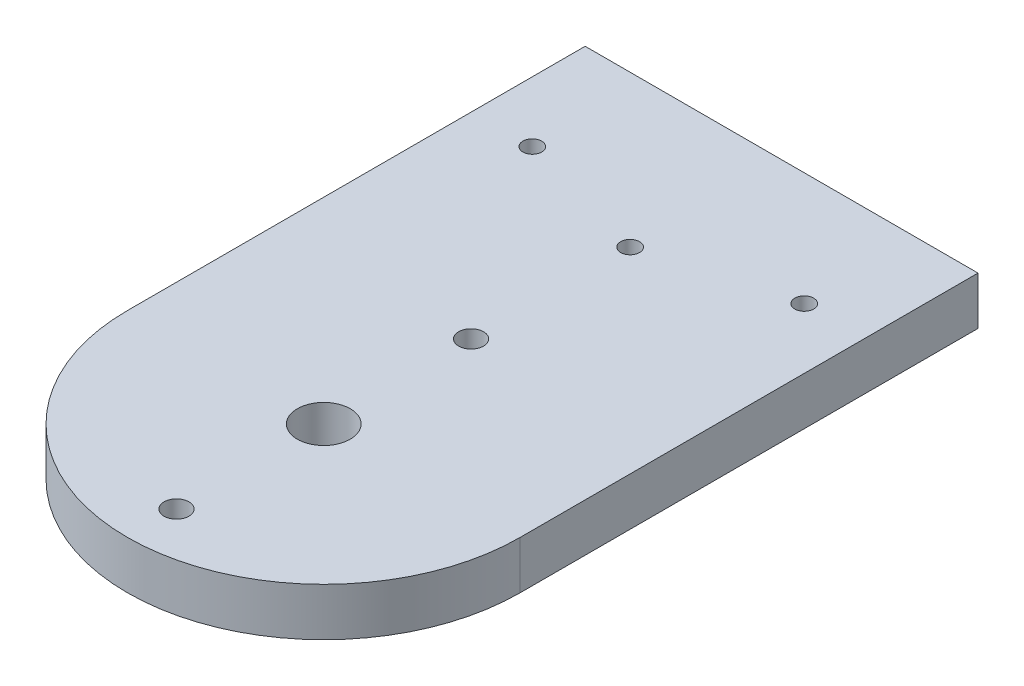
ISO-10303-21;
HEADER;
FILE_DESCRIPTION(('STEP AP214'),'2;1');
FILE_NAME('part.step','',(''),(''),'','','');
FILE_SCHEMA(('AUTOMOTIVE_DESIGN { 1 0 10303 214 1 1 1 1 }'));
ENDSEC;
DATA;
#1=APPLICATION_CONTEXT('core data for automotive mechanical design processes');
#2=APPLICATION_PROTOCOL_DEFINITION('international standard','automotive_design',2000,#1);
#3=PRODUCT_CONTEXT('',#1,'mechanical');
#4=PRODUCT('Part','Part','',(#3));
#5=PRODUCT_RELATED_PRODUCT_CATEGORY('part','',(#4));
#6=PRODUCT_DEFINITION_FORMATION('','',#4);
#7=PRODUCT_DEFINITION_CONTEXT('part definition',#1,'design');
#8=PRODUCT_DEFINITION('design','',#6,#7);
#9=PRODUCT_DEFINITION_SHAPE('','',#8);
#10=(LENGTH_UNIT() NAMED_UNIT(*) SI_UNIT(.MILLI.,.METRE.));
#11=(NAMED_UNIT(*) PLANE_ANGLE_UNIT() SI_UNIT($,.RADIAN.));
#12=(NAMED_UNIT(*) SI_UNIT($,.STERADIAN.) SOLID_ANGLE_UNIT());
#13=UNCERTAINTY_MEASURE_WITH_UNIT(LENGTH_MEASURE(1.E-05),#10,'distance_accuracy_value','');
#14=(GEOMETRIC_REPRESENTATION_CONTEXT(3) GLOBAL_UNCERTAINTY_ASSIGNED_CONTEXT((#13)) GLOBAL_UNIT_ASSIGNED_CONTEXT((#10,
#11,#12)) REPRESENTATION_CONTEXT('',''));
#15=CARTESIAN_POINT('',(0.,0.,0.));
#16=DIRECTION('',(0.,0.,1.));
#17=DIRECTION('',(1.,0.,0.));
#18=AXIS2_PLACEMENT_3D('',#15,#16,#17);
#19=CARTESIAN_POINT('',(126.4,-4.175,275.95));
#20=DIRECTION('',(1.,0.,0.));
#21=DIRECTION('',(0.,0.,-1.));
#22=AXIS2_PLACEMENT_3D('',#19,#20,#21);
#23=PLANE('',#22);
#24=DIRECTION('',(0.,0.,1.));
#25=VECTOR('',#24,1.);
#26=CARTESIAN_POINT('',(126.4,-10.525,275.95));
#27=LINE('',#26,#25);
#28=CARTESIAN_POINT('',(126.4,-10.525,275.95));
#29=VERTEX_POINT('',#28);
#30=CARTESIAN_POINT('',(126.4,-10.525,336.55));
#31=VERTEX_POINT('',#30);
#32=EDGE_CURVE('E92',#29,#31,#27,.T.);
#33=ORIENTED_EDGE('',*,*,#32,.T.);
#34=DIRECTION('',(0.,-1.,0.));
#35=VECTOR('',#34,1.);
#36=CARTESIAN_POINT('',(126.4,-4.175,336.55));
#37=LINE('',#36,#35);
#38=CARTESIAN_POINT('',(126.4,-4.175,336.55));
#39=VERTEX_POINT('',#38);
#40=EDGE_CURVE('E11',#39,#31,#37,.T.);
#41=ORIENTED_EDGE('',*,*,#40,.F.);
#42=DIRECTION('',(0.,0.,1.));
#43=VECTOR('',#42,1.);
#44=CARTESIAN_POINT('',(126.4,-4.175,275.95));
#45=LINE('',#44,#43);
#46=CARTESIAN_POINT('',(126.4,-4.175,275.95));
#47=VERTEX_POINT('',#46);
#48=EDGE_CURVE('E89',#47,#39,#45,.T.);
#49=ORIENTED_EDGE('',*,*,#48,.F.);
#50=DIRECTION('',(0.,-1.,0.));
#51=VECTOR('',#50,1.);
#52=CARTESIAN_POINT('',(126.4,-4.175,275.95));
#53=LINE('',#52,#51);
#54=EDGE_CURVE('E83',#47,#29,#53,.T.);
#55=ORIENTED_EDGE('',*,*,#54,.T.);
#56=EDGE_LOOP('',(#33,#41,#49,#55));
#57=FACE_BOUND('',#56,.T.);
#58=ADVANCED_FACE('F44',(#57),#23,.F.);
#59=CARTESIAN_POINT('',(178.4,-4.175,275.95));
#60=DIRECTION('',(-1.,0.,0.));
#61=DIRECTION('',(0.,0.,1.));
#62=AXIS2_PLACEMENT_3D('',#59,#60,#61);
#63=PLANE('',#62);
#64=DIRECTION('',(0.,0.,-1.));
#65=VECTOR('',#64,1.);
#66=CARTESIAN_POINT('',(178.4,-10.525,275.95));
#67=LINE('',#66,#65);
#68=CARTESIAN_POINT('',(178.4,-10.525,336.55));
#69=VERTEX_POINT('',#68);
#70=CARTESIAN_POINT('',(178.4,-10.525,275.95));
#71=VERTEX_POINT('',#70);
#72=EDGE_CURVE('E77',#69,#71,#67,.T.);
#73=ORIENTED_EDGE('',*,*,#72,.T.);
#74=DIRECTION('',(0.,-1.,0.));
#75=VECTOR('',#74,1.);
#76=CARTESIAN_POINT('',(178.4,-4.175,275.95));
#77=LINE('',#76,#75);
#78=CARTESIAN_POINT('',(178.4,-4.175,275.95));
#79=VERTEX_POINT('',#78);
#80=EDGE_CURVE('E86',#79,#71,#77,.T.);
#81=ORIENTED_EDGE('',*,*,#80,.F.);
#82=DIRECTION('',(0.,0.,-1.));
#83=VECTOR('',#82,1.);
#84=CARTESIAN_POINT('',(178.4,-4.175,275.95));
#85=LINE('',#84,#83);
#86=CARTESIAN_POINT('',(178.4,-4.175,336.55));
#87=VERTEX_POINT('',#86);
#88=EDGE_CURVE('E117',#87,#79,#85,.T.);
#89=ORIENTED_EDGE('',*,*,#88,.F.);
#90=DIRECTION('',(0.,-1.,0.));
#91=VECTOR('',#90,1.);
#92=CARTESIAN_POINT('',(178.4,-4.175,336.55));
#93=LINE('',#92,#91);
#94=EDGE_CURVE('E53',#87,#69,#93,.T.);
#95=ORIENTED_EDGE('',*,*,#94,.T.);
#96=EDGE_LOOP('',(#73,#81,#89,#95));
#97=FACE_BOUND('',#96,.T.);
#98=ADVANCED_FACE('F116',(#97),#63,.F.);
#99=CARTESIAN_POINT('',(126.4,-4.175,275.95));
#100=DIRECTION('',(0.,0.,1.));
#101=DIRECTION('',(1.,0.,0.));
#102=AXIS2_PLACEMENT_3D('',#99,#100,#101);
#103=PLANE('',#102);
#104=CARTESIAN_POINT('',(130.4,-7.35,275.95));
#105=DIRECTION('',(0.,0.,1.));
#106=DIRECTION('',(1.,0.,0.));
#107=AXIS2_PLACEMENT_3D('',#104,#105,#106);
#108=CIRCLE('',#107,2.);
#109=CARTESIAN_POINT('',(132.4,-7.35,275.95));
#110=VERTEX_POINT('',#109);
#111=EDGE_CURVE('E185',#110,#110,#108,.T.);
#112=ORIENTED_EDGE('',*,*,#111,.T.);
#113=EDGE_LOOP('',(#112));
#114=FACE_BOUND('',#113,.T.);
#115=CARTESIAN_POINT('',(174.4,-7.35,275.95));
#116=DIRECTION('',(0.,0.,1.));
#117=DIRECTION('',(1.,0.,0.));
#118=AXIS2_PLACEMENT_3D('',#115,#116,#117);
#119=CIRCLE('',#118,2.);
#120=CARTESIAN_POINT('',(176.4,-7.35,275.95));
#121=VERTEX_POINT('',#120);
#122=EDGE_CURVE('E180',#121,#121,#119,.T.);
#123=ORIENTED_EDGE('',*,*,#122,.T.);
#124=EDGE_LOOP('',(#123));
#125=FACE_BOUND('',#124,.T.);
#126=DIRECTION('',(-1.,0.,0.));
#127=VECTOR('',#126,1.);
#128=CARTESIAN_POINT('',(126.4,-10.525,275.95));
#129=LINE('',#128,#127);
#130=EDGE_CURVE('E84',#71,#29,#129,.T.);
#131=ORIENTED_EDGE('',*,*,#130,.T.);
#132=ORIENTED_EDGE('',*,*,#54,.F.);
#133=DIRECTION('',(-1.,0.,0.));
#134=VECTOR('',#133,1.);
#135=CARTESIAN_POINT('',(126.4,-4.175,275.95));
#136=LINE('',#135,#134);
#137=EDGE_CURVE('E61',#79,#47,#136,.T.);
#138=ORIENTED_EDGE('',*,*,#137,.F.);
#139=ORIENTED_EDGE('',*,*,#80,.T.);
#140=EDGE_LOOP('',(#131,#132,#138,#139));
#141=FACE_BOUND('',#140,.T.);
#142=ADVANCED_FACE('F85',(#114,#125,#141),#103,.F.);
#143=CARTESIAN_POINT('',(0.,-4.175,0.));
#144=DIRECTION('',(0.,1.,0.));
#145=DIRECTION('',(0.,0.,1.));
#146=AXIS2_PLACEMENT_3D('',#143,#144,#145);
#147=PLANE('',#146);
#148=CARTESIAN_POINT('',(152.4,-4.175,296.));
#149=DIRECTION('',(0.,1.,0.));
#150=DIRECTION('',(0.,0.,1.));
#151=AXIS2_PLACEMENT_3D('',#148,#149,#150);
#152=CIRCLE('',#151,1.25);
#153=CARTESIAN_POINT('',(152.4,-4.175,294.75));
#154=VERTEX_POINT('',#153);
#155=EDGE_CURVE('E178',#154,#154,#152,.T.);
#156=ORIENTED_EDGE('',*,*,#155,.F.);
#157=EDGE_LOOP('',(#156));
#158=FACE_BOUND('',#157,.T.);
#159=CARTESIAN_POINT('',(134.4,-4.175,290.95));
#160=DIRECTION('',(0.,1.,0.));
#161=DIRECTION('',(0.,0.,1.));
#162=AXIS2_PLACEMENT_3D('',#159,#160,#161);
#163=CIRCLE('',#162,1.25);
#164=CARTESIAN_POINT('',(134.4,-4.175,289.7));
#165=VERTEX_POINT('',#164);
#166=EDGE_CURVE('E149',#165,#165,#163,.T.);
#167=ORIENTED_EDGE('',*,*,#166,.F.);
#168=EDGE_LOOP('',(#167));
#169=FACE_BOUND('',#168,.T.);
#170=CARTESIAN_POINT('',(170.4,-4.175,290.95));
#171=DIRECTION('',(0.,1.,0.));
#172=DIRECTION('',(0.,0.,1.));
#173=AXIS2_PLACEMENT_3D('',#170,#171,#172);
#174=CIRCLE('',#173,1.25);
#175=CARTESIAN_POINT('',(170.4,-4.175,289.7));
#176=VERTEX_POINT('',#175);
#177=EDGE_CURVE('E156',#176,#176,#174,.T.);
#178=ORIENTED_EDGE('',*,*,#177,.F.);
#179=EDGE_LOOP('',(#178));
#180=FACE_BOUND('',#179,.T.);
#181=CARTESIAN_POINT('',(152.4,-4.175,317.05));
#182=DIRECTION('',(0.,1.,0.));
#183=DIRECTION('',(0.,0.,1.));
#184=AXIS2_PLACEMENT_3D('',#181,#182,#183);
#185=CIRCLE('',#184,1.65000000000002);
#186=CARTESIAN_POINT('',(152.4,-4.175,315.4));
#187=VERTEX_POINT('',#186);
#188=EDGE_CURVE('E142',#187,#187,#185,.T.);
#189=ORIENTED_EDGE('',*,*,#188,.F.);
#190=EDGE_LOOP('',(#189));
#191=FACE_BOUND('',#190,.T.);
#192=CARTESIAN_POINT('',(152.4,-4.175,356.05));
#193=DIRECTION('',(0.,1.,0.));
#194=DIRECTION('',(0.,0.,1.));
#195=AXIS2_PLACEMENT_3D('',#192,#193,#194);
#196=CIRCLE('',#195,1.65000000000002);
#197=CARTESIAN_POINT('',(152.4,-4.175,354.4));
#198=VERTEX_POINT('',#197);
#199=EDGE_CURVE('E147',#198,#198,#196,.T.);
#200=ORIENTED_EDGE('',*,*,#199,.F.);
#201=EDGE_LOOP('',(#200));
#202=FACE_BOUND('',#201,.T.);
#203=CARTESIAN_POINT('',(152.4,-4.175,336.55));
#204=DIRECTION('',(0.,1.,0.));
#205=DIRECTION('',(0.,0.,1.));
#206=AXIS2_PLACEMENT_3D('',#203,#204,#205);
#207=CIRCLE('',#206,3.49999999999999);
#208=CARTESIAN_POINT('',(152.4,-4.175,333.05));
#209=VERTEX_POINT('',#208);
#210=EDGE_CURVE('E131',#209,#209,#207,.T.);
#211=ORIENTED_EDGE('',*,*,#210,.F.);
#212=EDGE_LOOP('',(#211));
#213=FACE_BOUND('',#212,.T.);
#214=ORIENTED_EDGE('',*,*,#48,.T.);
#215=CARTESIAN_POINT('',(152.4,-4.175,336.55));
#216=DIRECTION('',(0.,1.,0.));
#217=DIRECTION('',(0.,0.,1.));
#218=AXIS2_PLACEMENT_3D('',#215,#216,#217);
#219=CIRCLE('',#218,26.);
#220=EDGE_CURVE('E105',#39,#87,#219,.T.);
#221=ORIENTED_EDGE('',*,*,#220,.T.);
#222=ORIENTED_EDGE('',*,*,#88,.T.);
#223=ORIENTED_EDGE('',*,*,#137,.T.);
#224=EDGE_LOOP('',(#214,#221,#222,#223));
#225=FACE_BOUND('',#224,.T.);
#226=ADVANCED_FACE('F121',(#158,#169,#180,#191,#202,#213,#225),#147,.T.);
#227=CARTESIAN_POINT('',(0.,-10.525,0.));
#228=DIRECTION('',(0.,1.,0.));
#229=DIRECTION('',(0.,0.,1.));
#230=AXIS2_PLACEMENT_3D('',#227,#228,#229);
#231=PLANE('',#230);
#232=CARTESIAN_POINT('',(152.4,-10.525,296.));
#233=DIRECTION('',(0.,1.,0.));
#234=DIRECTION('',(0.,0.,1.));
#235=AXIS2_PLACEMENT_3D('',#232,#233,#234);
#236=CIRCLE('',#235,1.25);
#237=CARTESIAN_POINT('',(152.4,-10.525,294.75));
#238=VERTEX_POINT('',#237);
#239=EDGE_CURVE('E186',#238,#238,#236,.T.);
#240=ORIENTED_EDGE('',*,*,#239,.T.);
#241=EDGE_LOOP('',(#240));
#242=FACE_BOUND('',#241,.T.);
#243=CARTESIAN_POINT('',(134.4,-10.525,290.95));
#244=DIRECTION('',(0.,1.,0.));
#245=DIRECTION('',(0.,0.,1.));
#246=AXIS2_PLACEMENT_3D('',#243,#244,#245);
#247=CIRCLE('',#246,1.25);
#248=CARTESIAN_POINT('',(134.4,-10.525,289.7));
#249=VERTEX_POINT('',#248);
#250=EDGE_CURVE('E168',#249,#249,#247,.T.);
#251=ORIENTED_EDGE('',*,*,#250,.T.);
#252=EDGE_LOOP('',(#251));
#253=FACE_BOUND('',#252,.T.);
#254=CARTESIAN_POINT('',(170.4,-10.525,290.95));
#255=DIRECTION('',(0.,1.,0.));
#256=DIRECTION('',(0.,0.,1.));
#257=AXIS2_PLACEMENT_3D('',#254,#255,#256);
#258=CIRCLE('',#257,1.25);
#259=CARTESIAN_POINT('',(170.4,-10.525,289.7));
#260=VERTEX_POINT('',#259);
#261=EDGE_CURVE('E163',#260,#260,#258,.T.);
#262=ORIENTED_EDGE('',*,*,#261,.T.);
#263=EDGE_LOOP('',(#262));
#264=FACE_BOUND('',#263,.T.);
#265=CARTESIAN_POINT('',(152.4,-10.525,317.05));
#266=DIRECTION('',(0.,1.,0.));
#267=DIRECTION('',(0.,0.,1.));
#268=AXIS2_PLACEMENT_3D('',#265,#266,#267);
#269=CIRCLE('',#268,1.65000000000002);
#270=CARTESIAN_POINT('',(152.4,-10.525,315.4));
#271=VERTEX_POINT('',#270);
#272=EDGE_CURVE('E143',#271,#271,#269,.T.);
#273=ORIENTED_EDGE('',*,*,#272,.T.);
#274=EDGE_LOOP('',(#273));
#275=FACE_BOUND('',#274,.T.);
#276=CARTESIAN_POINT('',(152.4,-10.525,356.05));
#277=DIRECTION('',(0.,1.,0.));
#278=DIRECTION('',(0.,0.,1.));
#279=AXIS2_PLACEMENT_3D('',#276,#277,#278);
#280=CIRCLE('',#279,1.65000000000002);
#281=CARTESIAN_POINT('',(152.4,-10.525,354.4));
#282=VERTEX_POINT('',#281);
#283=EDGE_CURVE('E136',#282,#282,#280,.T.);
#284=ORIENTED_EDGE('',*,*,#283,.T.);
#285=EDGE_LOOP('',(#284));
#286=FACE_BOUND('',#285,.T.);
#287=CARTESIAN_POINT('',(152.4,-10.525,336.55));
#288=DIRECTION('',(0.,1.,0.));
#289=DIRECTION('',(0.,0.,1.));
#290=AXIS2_PLACEMENT_3D('',#287,#288,#289);
#291=CIRCLE('',#290,3.49999999999999);
#292=CARTESIAN_POINT('',(152.4,-10.525,333.05));
#293=VERTEX_POINT('',#292);
#294=EDGE_CURVE('E133',#293,#293,#291,.T.);
#295=ORIENTED_EDGE('',*,*,#294,.T.);
#296=EDGE_LOOP('',(#295));
#297=FACE_BOUND('',#296,.T.);
#298=ORIENTED_EDGE('',*,*,#72,.F.);
#299=CARTESIAN_POINT('',(152.4,-10.525,336.55));
#300=DIRECTION('',(0.,1.,0.));
#301=DIRECTION('',(0.,0.,1.));
#302=AXIS2_PLACEMENT_3D('',#299,#300,#301);
#303=CIRCLE('',#302,26.);
#304=EDGE_CURVE('E99',#31,#69,#303,.T.);
#305=ORIENTED_EDGE('',*,*,#304,.F.);
#306=ORIENTED_EDGE('',*,*,#32,.F.);
#307=ORIENTED_EDGE('',*,*,#130,.F.);
#308=EDGE_LOOP('',(#298,#305,#306,#307));
#309=FACE_BOUND('',#308,.T.);
#310=ADVANCED_FACE('F100',(#242,#253,#264,#275,#286,#297,#309),#231,.F.);
#311=CARTESIAN_POINT('',(152.4,-4.175,336.55));
#312=DIRECTION('',(0.,-1.,0.));
#313=DIRECTION('',(0.,0.,-1.));
#314=AXIS2_PLACEMENT_3D('',#311,#312,#313);
#315=CYLINDRICAL_SURFACE('',#314,26.);
#316=ORIENTED_EDGE('',*,*,#220,.F.);
#317=ORIENTED_EDGE('',*,*,#40,.T.);
#318=ORIENTED_EDGE('',*,*,#304,.T.);
#319=ORIENTED_EDGE('',*,*,#94,.F.);
#320=EDGE_LOOP('',(#316,#317,#318,#319));
#321=FACE_BOUND('',#320,.T.);
#322=ADVANCED_FACE('F122',(#321),#315,.T.);
#323=CARTESIAN_POINT('',(152.4,-4.175,336.55));
#324=DIRECTION('',(0.,-1.,0.));
#325=DIRECTION('',(0.,0.,-1.));
#326=AXIS2_PLACEMENT_3D('',#323,#324,#325);
#327=CYLINDRICAL_SURFACE('',#326,3.49999999999999);
#328=CARTESIAN_POINT('',(152.4,-4.175,333.05));
#329=CARTESIAN_POINT('',(152.4,-4.24114583333333,333.05));
#330=CARTESIAN_POINT('',(152.4,-4.30729166666667,333.05));
#331=CARTESIAN_POINT('',(152.4,-4.43958333333333,333.05));
#332=CARTESIAN_POINT('',(152.4,-4.50572916666667,333.05));
#333=CARTESIAN_POINT('',(152.4,-4.63802083333333,333.05));
#334=CARTESIAN_POINT('',(152.4,-4.70416666666667,333.05));
#335=CARTESIAN_POINT('',(152.4,-4.83645833333333,333.05));
#336=CARTESIAN_POINT('',(152.4,-4.90260416666667,333.05));
#337=CARTESIAN_POINT('',(152.4,-5.03489583333333,333.05));
#338=CARTESIAN_POINT('',(152.4,-5.10104166666667,333.05));
#339=CARTESIAN_POINT('',(152.4,-5.23333333333333,333.05));
#340=CARTESIAN_POINT('',(152.4,-5.29947916666667,333.05));
#341=CARTESIAN_POINT('',(152.4,-5.43177083333333,333.05));
#342=CARTESIAN_POINT('',(152.4,-5.49791666666667,333.05));
#343=CARTESIAN_POINT('',(152.4,-5.63020833333333,333.05));
#344=CARTESIAN_POINT('',(152.4,-5.69635416666667,333.05));
#345=CARTESIAN_POINT('',(152.4,-5.82864583333333,333.05));
#346=CARTESIAN_POINT('',(152.4,-5.89479166666667,333.05));
#347=CARTESIAN_POINT('',(152.4,-6.02708333333333,333.05));
#348=CARTESIAN_POINT('',(152.4,-6.09322916666667,333.05));
#349=CARTESIAN_POINT('',(152.4,-6.22552083333333,333.05));
#350=CARTESIAN_POINT('',(152.4,-6.29166666666667,333.05));
#351=CARTESIAN_POINT('',(152.4,-6.42395833333333,333.05));
#352=CARTESIAN_POINT('',(152.4,-6.49010416666667,333.05));
#353=CARTESIAN_POINT('',(152.4,-6.62239583333333,333.05));
#354=CARTESIAN_POINT('',(152.4,-6.68854166666667,333.05));
#355=CARTESIAN_POINT('',(152.4,-6.82083333333333,333.05));
#356=CARTESIAN_POINT('',(152.4,-6.88697916666667,333.05));
#357=CARTESIAN_POINT('',(152.4,-7.01927083333333,333.05));
#358=CARTESIAN_POINT('',(152.4,-7.08541666666667,333.05));
#359=CARTESIAN_POINT('',(152.4,-7.21770833333333,333.05));
#360=CARTESIAN_POINT('',(152.4,-7.28385416666667,333.05));
#361=CARTESIAN_POINT('',(152.4,-7.41614583333333,333.05));
#362=CARTESIAN_POINT('',(152.4,-7.48229166666667,333.05));
#363=CARTESIAN_POINT('',(152.4,-7.61458333333333,333.05));
#364=CARTESIAN_POINT('',(152.4,-7.68072916666667,333.05));
#365=CARTESIAN_POINT('',(152.4,-7.81302083333333,333.05));
#366=CARTESIAN_POINT('',(152.4,-7.87916666666667,333.05));
#367=CARTESIAN_POINT('',(152.4,-8.01145833333334,333.05));
#368=CARTESIAN_POINT('',(152.4,-8.07760416666667,333.05));
#369=CARTESIAN_POINT('',(152.4,-8.20989583333333,333.05));
#370=CARTESIAN_POINT('',(152.4,-8.27604166666667,333.05));
#371=CARTESIAN_POINT('',(152.4,-8.40833333333333,333.05));
#372=CARTESIAN_POINT('',(152.4,-8.47447916666667,333.05));
#373=CARTESIAN_POINT('',(152.4,-8.60677083333333,333.05));
#374=CARTESIAN_POINT('',(152.4,-8.67291666666667,333.05));
#375=CARTESIAN_POINT('',(152.4,-8.80520833333333,333.05));
#376=CARTESIAN_POINT('',(152.4,-8.87135416666667,333.05));
#377=CARTESIAN_POINT('',(152.4,-9.00364583333333,333.05));
#378=CARTESIAN_POINT('',(152.4,-9.06979166666667,333.05));
#379=CARTESIAN_POINT('',(152.4,-9.20208333333333,333.05));
#380=CARTESIAN_POINT('',(152.4,-9.26822916666667,333.05));
#381=CARTESIAN_POINT('',(152.4,-9.40052083333333,333.05));
#382=CARTESIAN_POINT('',(152.4,-9.46666666666667,333.05));
#383=CARTESIAN_POINT('',(152.4,-9.59895833333333,333.05));
#384=CARTESIAN_POINT('',(152.4,-9.66510416666667,333.05));
#385=CARTESIAN_POINT('',(152.4,-9.79739583333333,333.05));
#386=CARTESIAN_POINT('',(152.4,-9.86354166666667,333.05));
#387=CARTESIAN_POINT('',(152.4,-9.99583333333333,333.05));
#388=CARTESIAN_POINT('',(152.4,-10.0619791666667,333.05));
#389=CARTESIAN_POINT('',(152.4,-10.1942708333333,333.05));
#390=CARTESIAN_POINT('',(152.4,-10.2604166666667,333.05));
#391=CARTESIAN_POINT('',(152.4,-10.3927083333333,333.05));
#392=CARTESIAN_POINT('',(152.4,-10.4588541666667,333.05));
#393=CARTESIAN_POINT('',(152.4,-10.525,333.05));
#394=B_SPLINE_CURVE_WITH_KNOTS('',3,(#328,#329,#330,#331,#332,#333,#334,#335,#336,#337,#338,
#339,#340,#341,#342,#343,#344,#345,#346,#347,#348,#349,#350,#351,#352,#353,#354,#355,#356,#357,
#358,#359,#360,#361,#362,#363,#364,#365,#366,#367,#368,#369,#370,#371,#372,#373,#374,#375,#376,
#377,#378,#379,#380,#381,#382,#383,#384,#385,#386,#387,#388,#389,#390,#391,#392,#393),
.UNSPECIFIED.,.F.,.F.,(4,2,2,2,2,2,2,2,2,2,2,2,2,2,2,2,2,2,2,2,2,2,2,2,2,2,2,2,2,2,2,2,4),(0.,
0.198437500000001,0.396875000000001,0.5953125,0.79375,0.992187500000001,1.190625,1.3890625,
1.5875,1.7859375,1.984375,2.1828125,2.38125,2.5796875,2.778125,2.9765625,3.175,3.3734375,
3.571875,3.7703125,3.96875,4.1671875,4.365625,4.5640625,4.7625,4.9609375,5.159375,5.3578125,
5.55625,5.7546875,5.953125,6.1515625,6.35),.UNSPECIFIED.);
#395=EDGE_CURVE('BSEAM215',#209,#293,#394,.T.);
#396=ORIENTED_EDGE('',*,*,#210,.T.);
#397=ORIENTED_EDGE('',*,*,#294,.F.);
#398=ORIENTED_EDGE('',*,*,#395,.T.);
#399=ORIENTED_EDGE('',*,*,#395,.F.);
#400=EDGE_LOOP('',(#396,#398,#397,#399));
#401=FACE_BOUND('',#400,.T.);
#402=ADVANCED_FACE('F215',(#401),#327,.F.);
#403=CARTESIAN_POINT('',(152.4,-4.175,356.05));
#404=DIRECTION('',(0.,-1.,0.));
#405=DIRECTION('',(0.,0.,-1.));
#406=AXIS2_PLACEMENT_3D('',#403,#404,#405);
#407=CYLINDRICAL_SURFACE('',#406,1.65000000000002);
#408=CARTESIAN_POINT('',(152.4,-4.175,354.4));
#409=CARTESIAN_POINT('',(152.4,-4.24114583333333,354.4));
#410=CARTESIAN_POINT('',(152.4,-4.30729166666667,354.4));
#411=CARTESIAN_POINT('',(152.4,-4.43958333333333,354.4));
#412=CARTESIAN_POINT('',(152.4,-4.50572916666667,354.4));
#413=CARTESIAN_POINT('',(152.4,-4.63802083333333,354.4));
#414=CARTESIAN_POINT('',(152.4,-4.70416666666667,354.4));
#415=CARTESIAN_POINT('',(152.4,-4.83645833333333,354.4));
#416=CARTESIAN_POINT('',(152.4,-4.90260416666667,354.4));
#417=CARTESIAN_POINT('',(152.4,-5.03489583333333,354.4));
#418=CARTESIAN_POINT('',(152.4,-5.10104166666667,354.4));
#419=CARTESIAN_POINT('',(152.4,-5.23333333333333,354.4));
#420=CARTESIAN_POINT('',(152.4,-5.29947916666667,354.4));
#421=CARTESIAN_POINT('',(152.4,-5.43177083333333,354.4));
#422=CARTESIAN_POINT('',(152.4,-5.49791666666667,354.4));
#423=CARTESIAN_POINT('',(152.4,-5.63020833333333,354.4));
#424=CARTESIAN_POINT('',(152.4,-5.69635416666667,354.4));
#425=CARTESIAN_POINT('',(152.4,-5.82864583333333,354.4));
#426=CARTESIAN_POINT('',(152.4,-5.89479166666667,354.4));
#427=CARTESIAN_POINT('',(152.4,-6.02708333333333,354.4));
#428=CARTESIAN_POINT('',(152.4,-6.09322916666667,354.4));
#429=CARTESIAN_POINT('',(152.4,-6.22552083333333,354.4));
#430=CARTESIAN_POINT('',(152.4,-6.29166666666667,354.4));
#431=CARTESIAN_POINT('',(152.4,-6.42395833333333,354.4));
#432=CARTESIAN_POINT('',(152.4,-6.49010416666667,354.4));
#433=CARTESIAN_POINT('',(152.4,-6.62239583333333,354.4));
#434=CARTESIAN_POINT('',(152.4,-6.68854166666667,354.4));
#435=CARTESIAN_POINT('',(152.4,-6.82083333333333,354.4));
#436=CARTESIAN_POINT('',(152.4,-6.88697916666667,354.4));
#437=CARTESIAN_POINT('',(152.4,-7.01927083333333,354.4));
#438=CARTESIAN_POINT('',(152.4,-7.08541666666667,354.4));
#439=CARTESIAN_POINT('',(152.4,-7.21770833333333,354.4));
#440=CARTESIAN_POINT('',(152.4,-7.28385416666667,354.4));
#441=CARTESIAN_POINT('',(152.4,-7.41614583333333,354.4));
#442=CARTESIAN_POINT('',(152.4,-7.48229166666667,354.4));
#443=CARTESIAN_POINT('',(152.4,-7.61458333333333,354.4));
#444=CARTESIAN_POINT('',(152.4,-7.68072916666667,354.4));
#445=CARTESIAN_POINT('',(152.4,-7.81302083333333,354.4));
#446=CARTESIAN_POINT('',(152.4,-7.87916666666667,354.4));
#447=CARTESIAN_POINT('',(152.4,-8.01145833333333,354.4));
#448=CARTESIAN_POINT('',(152.4,-8.07760416666667,354.4));
#449=CARTESIAN_POINT('',(152.4,-8.20989583333333,354.4));
#450=CARTESIAN_POINT('',(152.4,-8.27604166666667,354.4));
#451=CARTESIAN_POINT('',(152.4,-8.40833333333333,354.4));
#452=CARTESIAN_POINT('',(152.4,-8.47447916666667,354.4));
#453=CARTESIAN_POINT('',(152.4,-8.60677083333333,354.4));
#454=CARTESIAN_POINT('',(152.4,-8.67291666666667,354.4));
#455=CARTESIAN_POINT('',(152.4,-8.80520833333333,354.4));
#456=CARTESIAN_POINT('',(152.4,-8.87135416666667,354.4));
#457=CARTESIAN_POINT('',(152.4,-9.00364583333333,354.4));
#458=CARTESIAN_POINT('',(152.4,-9.06979166666667,354.4));
#459=CARTESIAN_POINT('',(152.4,-9.20208333333333,354.4));
#460=CARTESIAN_POINT('',(152.4,-9.26822916666667,354.4));
#461=CARTESIAN_POINT('',(152.4,-9.40052083333333,354.4));
#462=CARTESIAN_POINT('',(152.4,-9.46666666666667,354.4));
#463=CARTESIAN_POINT('',(152.4,-9.59895833333333,354.4));
#464=CARTESIAN_POINT('',(152.4,-9.66510416666667,354.4));
#465=CARTESIAN_POINT('',(152.4,-9.79739583333333,354.4));
#466=CARTESIAN_POINT('',(152.4,-9.86354166666667,354.4));
#467=CARTESIAN_POINT('',(152.4,-9.99583333333333,354.4));
#468=CARTESIAN_POINT('',(152.4,-10.0619791666667,354.4));
#469=CARTESIAN_POINT('',(152.4,-10.1942708333333,354.4));
#470=CARTESIAN_POINT('',(152.4,-10.2604166666667,354.4));
#471=CARTESIAN_POINT('',(152.4,-10.3927083333333,354.4));
#472=CARTESIAN_POINT('',(152.4,-10.4588541666667,354.4));
#473=CARTESIAN_POINT('',(152.4,-10.525,354.4));
#474=B_SPLINE_CURVE_WITH_KNOTS('',3,(#408,#409,#410,#411,#412,#413,#414,#415,#416,#417,#418,
#419,#420,#421,#422,#423,#424,#425,#426,#427,#428,#429,#430,#431,#432,#433,#434,#435,#436,#437,
#438,#439,#440,#441,#442,#443,#444,#445,#446,#447,#448,#449,#450,#451,#452,#453,#454,#455,#456,
#457,#458,#459,#460,#461,#462,#463,#464,#465,#466,#467,#468,#469,#470,#471,#472,#473),
.UNSPECIFIED.,.F.,.F.,(4,2,2,2,2,2,2,2,2,2,2,2,2,2,2,2,2,2,2,2,2,2,2,2,2,2,2,2,2,2,2,2,4),(0.,
0.1984375,0.396875,0.595312499999999,0.793749999999999,0.992187499999999,1.190625,1.3890625,
1.5875,1.7859375,1.984375,2.1828125,2.38125,2.5796875,2.778125,2.9765625,3.175,3.3734375,
3.571875,3.7703125,3.96875,4.1671875,4.365625,4.5640625,4.7625,4.9609375,5.159375,5.3578125,
5.55625,5.7546875,5.953125,6.1515625,6.35),.UNSPECIFIED.);
#475=EDGE_CURVE('BSEAM216',#198,#282,#474,.T.);
#476=ORIENTED_EDGE('',*,*,#199,.T.);
#477=ORIENTED_EDGE('',*,*,#283,.F.);
#478=ORIENTED_EDGE('',*,*,#475,.T.);
#479=ORIENTED_EDGE('',*,*,#475,.F.);
#480=EDGE_LOOP('',(#476,#478,#477,#479));
#481=FACE_BOUND('',#480,.T.);
#482=ADVANCED_FACE('F216',(#481),#407,.F.);
#483=CARTESIAN_POINT('',(152.4,-4.175,317.05));
#484=DIRECTION('',(0.,-1.,0.));
#485=DIRECTION('',(0.,0.,-1.));
#486=AXIS2_PLACEMENT_3D('',#483,#484,#485);
#487=CYLINDRICAL_SURFACE('',#486,1.65000000000002);
#488=CARTESIAN_POINT('',(152.4,-4.175,315.4));
#489=CARTESIAN_POINT('',(152.4,-4.24114583333333,315.4));
#490=CARTESIAN_POINT('',(152.4,-4.30729166666667,315.4));
#491=CARTESIAN_POINT('',(152.4,-4.43958333333333,315.4));
#492=CARTESIAN_POINT('',(152.4,-4.50572916666667,315.4));
#493=CARTESIAN_POINT('',(152.4,-4.63802083333333,315.4));
#494=CARTESIAN_POINT('',(152.4,-4.70416666666667,315.4));
#495=CARTESIAN_POINT('',(152.4,-4.83645833333333,315.4));
#496=CARTESIAN_POINT('',(152.4,-4.90260416666667,315.4));
#497=CARTESIAN_POINT('',(152.4,-5.03489583333333,315.4));
#498=CARTESIAN_POINT('',(152.4,-5.10104166666667,315.4));
#499=CARTESIAN_POINT('',(152.4,-5.23333333333333,315.4));
#500=CARTESIAN_POINT('',(152.4,-5.29947916666667,315.4));
#501=CARTESIAN_POINT('',(152.4,-5.43177083333333,315.4));
#502=CARTESIAN_POINT('',(152.4,-5.49791666666667,315.4));
#503=CARTESIAN_POINT('',(152.4,-5.63020833333333,315.4));
#504=CARTESIAN_POINT('',(152.4,-5.69635416666667,315.4));
#505=CARTESIAN_POINT('',(152.4,-5.82864583333333,315.4));
#506=CARTESIAN_POINT('',(152.4,-5.89479166666667,315.4));
#507=CARTESIAN_POINT('',(152.4,-6.02708333333333,315.4));
#508=CARTESIAN_POINT('',(152.4,-6.09322916666667,315.4));
#509=CARTESIAN_POINT('',(152.4,-6.22552083333333,315.4));
#510=CARTESIAN_POINT('',(152.4,-6.29166666666667,315.4));
#511=CARTESIAN_POINT('',(152.4,-6.42395833333333,315.4));
#512=CARTESIAN_POINT('',(152.4,-6.49010416666667,315.4));
#513=CARTESIAN_POINT('',(152.4,-6.62239583333333,315.4));
#514=CARTESIAN_POINT('',(152.4,-6.68854166666667,315.4));
#515=CARTESIAN_POINT('',(152.4,-6.82083333333333,315.4));
#516=CARTESIAN_POINT('',(152.4,-6.88697916666667,315.4));
#517=CARTESIAN_POINT('',(152.4,-7.01927083333333,315.4));
#518=CARTESIAN_POINT('',(152.4,-7.08541666666667,315.4));
#519=CARTESIAN_POINT('',(152.4,-7.21770833333333,315.4));
#520=CARTESIAN_POINT('',(152.4,-7.28385416666667,315.4));
#521=CARTESIAN_POINT('',(152.4,-7.41614583333333,315.4));
#522=CARTESIAN_POINT('',(152.4,-7.48229166666667,315.4));
#523=CARTESIAN_POINT('',(152.4,-7.61458333333333,315.4));
#524=CARTESIAN_POINT('',(152.4,-7.68072916666667,315.4));
#525=CARTESIAN_POINT('',(152.4,-7.81302083333333,315.4));
#526=CARTESIAN_POINT('',(152.4,-7.87916666666667,315.4));
#527=CARTESIAN_POINT('',(152.4,-8.01145833333333,315.4));
#528=CARTESIAN_POINT('',(152.4,-8.07760416666667,315.4));
#529=CARTESIAN_POINT('',(152.4,-8.20989583333333,315.4));
#530=CARTESIAN_POINT('',(152.4,-8.27604166666667,315.4));
#531=CARTESIAN_POINT('',(152.4,-8.40833333333333,315.4));
#532=CARTESIAN_POINT('',(152.4,-8.47447916666667,315.4));
#533=CARTESIAN_POINT('',(152.4,-8.60677083333333,315.4));
#534=CARTESIAN_POINT('',(152.4,-8.67291666666667,315.4));
#535=CARTESIAN_POINT('',(152.4,-8.80520833333333,315.4));
#536=CARTESIAN_POINT('',(152.4,-8.87135416666667,315.4));
#537=CARTESIAN_POINT('',(152.4,-9.00364583333333,315.4));
#538=CARTESIAN_POINT('',(152.4,-9.06979166666667,315.4));
#539=CARTESIAN_POINT('',(152.4,-9.20208333333333,315.4));
#540=CARTESIAN_POINT('',(152.4,-9.26822916666667,315.4));
#541=CARTESIAN_POINT('',(152.4,-9.40052083333333,315.4));
#542=CARTESIAN_POINT('',(152.4,-9.46666666666667,315.4));
#543=CARTESIAN_POINT('',(152.4,-9.59895833333333,315.4));
#544=CARTESIAN_POINT('',(152.4,-9.66510416666667,315.4));
#545=CARTESIAN_POINT('',(152.4,-9.79739583333333,315.4));
#546=CARTESIAN_POINT('',(152.4,-9.86354166666667,315.4));
#547=CARTESIAN_POINT('',(152.4,-9.99583333333333,315.4));
#548=CARTESIAN_POINT('',(152.4,-10.0619791666667,315.4));
#549=CARTESIAN_POINT('',(152.4,-10.1942708333333,315.4));
#550=CARTESIAN_POINT('',(152.4,-10.2604166666667,315.4));
#551=CARTESIAN_POINT('',(152.4,-10.3927083333333,315.4));
#552=CARTESIAN_POINT('',(152.4,-10.4588541666667,315.4));
#553=CARTESIAN_POINT('',(152.4,-10.525,315.4));
#554=B_SPLINE_CURVE_WITH_KNOTS('',3,(#488,#489,#490,#491,#492,#493,#494,#495,#496,#497,#498,
#499,#500,#501,#502,#503,#504,#505,#506,#507,#508,#509,#510,#511,#512,#513,#514,#515,#516,#517,
#518,#519,#520,#521,#522,#523,#524,#525,#526,#527,#528,#529,#530,#531,#532,#533,#534,#535,#536,
#537,#538,#539,#540,#541,#542,#543,#544,#545,#546,#547,#548,#549,#550,#551,#552,#553),
.UNSPECIFIED.,.F.,.F.,(4,2,2,2,2,2,2,2,2,2,2,2,2,2,2,2,2,2,2,2,2,2,2,2,2,2,2,2,2,2,2,2,4),(0.,
0.1984375,0.396875,0.595312499999999,0.793749999999999,0.992187499999999,1.190625,1.3890625,
1.5875,1.7859375,1.984375,2.1828125,2.38125,2.5796875,2.778125,2.9765625,3.175,3.3734375,
3.571875,3.7703125,3.96875,4.1671875,4.365625,4.5640625,4.7625,4.9609375,5.159375,5.3578125,
5.55625,5.7546875,5.953125,6.1515625,6.35),.UNSPECIFIED.);
#555=EDGE_CURVE('BSEAM264',#187,#271,#554,.T.);
#556=ORIENTED_EDGE('',*,*,#188,.T.);
#557=ORIENTED_EDGE('',*,*,#272,.F.);
#558=ORIENTED_EDGE('',*,*,#555,.T.);
#559=ORIENTED_EDGE('',*,*,#555,.F.);
#560=EDGE_LOOP('',(#556,#558,#557,#559));
#561=FACE_BOUND('',#560,.T.);
#562=ADVANCED_FACE('F264',(#561),#487,.F.);
#563=CARTESIAN_POINT('',(170.4,-4.175,290.95));
#564=DIRECTION('',(0.,-1.,0.));
#565=DIRECTION('',(0.,0.,-1.));
#566=AXIS2_PLACEMENT_3D('',#563,#564,#565);
#567=CYLINDRICAL_SURFACE('',#566,1.25);
#568=CARTESIAN_POINT('',(170.4,-4.175,289.7));
#569=CARTESIAN_POINT('',(170.4,-4.24114583333333,289.7));
#570=CARTESIAN_POINT('',(170.4,-4.30729166666667,289.7));
#571=CARTESIAN_POINT('',(170.4,-4.43958333333333,289.7));
#572=CARTESIAN_POINT('',(170.4,-4.50572916666667,289.7));
#573=CARTESIAN_POINT('',(170.4,-4.63802083333333,289.7));
#574=CARTESIAN_POINT('',(170.4,-4.70416666666667,289.7));
#575=CARTESIAN_POINT('',(170.4,-4.83645833333333,289.7));
#576=CARTESIAN_POINT('',(170.4,-4.90260416666667,289.7));
#577=CARTESIAN_POINT('',(170.4,-5.03489583333333,289.7));
#578=CARTESIAN_POINT('',(170.4,-5.10104166666667,289.7));
#579=CARTESIAN_POINT('',(170.4,-5.23333333333333,289.7));
#580=CARTESIAN_POINT('',(170.4,-5.29947916666667,289.7));
#581=CARTESIAN_POINT('',(170.4,-5.43177083333333,289.7));
#582=CARTESIAN_POINT('',(170.4,-5.49791666666667,289.7));
#583=CARTESIAN_POINT('',(170.4,-5.63020833333333,289.7));
#584=CARTESIAN_POINT('',(170.4,-5.69635416666667,289.7));
#585=CARTESIAN_POINT('',(170.4,-5.82864583333333,289.7));
#586=CARTESIAN_POINT('',(170.4,-5.89479166666667,289.7));
#587=CARTESIAN_POINT('',(170.4,-6.02708333333333,289.7));
#588=CARTESIAN_POINT('',(170.4,-6.09322916666667,289.7));
#589=CARTESIAN_POINT('',(170.4,-6.22552083333333,289.7));
#590=CARTESIAN_POINT('',(170.4,-6.29166666666667,289.7));
#591=CARTESIAN_POINT('',(170.4,-6.42395833333333,289.7));
#592=CARTESIAN_POINT('',(170.4,-6.49010416666667,289.7));
#593=CARTESIAN_POINT('',(170.4,-6.62239583333333,289.7));
#594=CARTESIAN_POINT('',(170.4,-6.68854166666667,289.7));
#595=CARTESIAN_POINT('',(170.4,-6.82083333333333,289.7));
#596=CARTESIAN_POINT('',(170.4,-6.88697916666667,289.7));
#597=CARTESIAN_POINT('',(170.4,-7.01927083333333,289.7));
#598=CARTESIAN_POINT('',(170.4,-7.08541666666667,289.7));
#599=CARTESIAN_POINT('',(170.4,-7.21770833333333,289.7));
#600=CARTESIAN_POINT('',(170.4,-7.28385416666667,289.7));
#601=CARTESIAN_POINT('',(170.4,-7.41614583333333,289.7));
#602=CARTESIAN_POINT('',(170.4,-7.48229166666667,289.7));
#603=CARTESIAN_POINT('',(170.4,-7.61458333333333,289.7));
#604=CARTESIAN_POINT('',(170.4,-7.68072916666667,289.7));
#605=CARTESIAN_POINT('',(170.4,-7.81302083333333,289.7));
#606=CARTESIAN_POINT('',(170.4,-7.87916666666667,289.7));
#607=CARTESIAN_POINT('',(170.4,-8.01145833333333,289.7));
#608=CARTESIAN_POINT('',(170.4,-8.07760416666667,289.7));
#609=CARTESIAN_POINT('',(170.4,-8.20989583333333,289.7));
#610=CARTESIAN_POINT('',(170.4,-8.27604166666667,289.7));
#611=CARTESIAN_POINT('',(170.4,-8.40833333333333,289.7));
#612=CARTESIAN_POINT('',(170.4,-8.47447916666667,289.7));
#613=CARTESIAN_POINT('',(170.4,-8.60677083333333,289.7));
#614=CARTESIAN_POINT('',(170.4,-8.67291666666667,289.7));
#615=CARTESIAN_POINT('',(170.4,-8.80520833333333,289.7));
#616=CARTESIAN_POINT('',(170.4,-8.87135416666667,289.7));
#617=CARTESIAN_POINT('',(170.4,-9.00364583333333,289.7));
#618=CARTESIAN_POINT('',(170.4,-9.06979166666667,289.7));
#619=CARTESIAN_POINT('',(170.4,-9.20208333333333,289.7));
#620=CARTESIAN_POINT('',(170.4,-9.26822916666667,289.7));
#621=CARTESIAN_POINT('',(170.4,-9.40052083333333,289.7));
#622=CARTESIAN_POINT('',(170.4,-9.46666666666667,289.7));
#623=CARTESIAN_POINT('',(170.4,-9.59895833333333,289.7));
#624=CARTESIAN_POINT('',(170.4,-9.66510416666667,289.7));
#625=CARTESIAN_POINT('',(170.4,-9.79739583333333,289.7));
#626=CARTESIAN_POINT('',(170.4,-9.86354166666667,289.7));
#627=CARTESIAN_POINT('',(170.4,-9.99583333333333,289.7));
#628=CARTESIAN_POINT('',(170.4,-10.0619791666667,289.7));
#629=CARTESIAN_POINT('',(170.4,-10.1942708333333,289.7));
#630=CARTESIAN_POINT('',(170.4,-10.2604166666667,289.7));
#631=CARTESIAN_POINT('',(170.4,-10.3927083333333,289.7));
#632=CARTESIAN_POINT('',(170.4,-10.4588541666667,289.7));
#633=CARTESIAN_POINT('',(170.4,-10.525,289.7));
#634=B_SPLINE_CURVE_WITH_KNOTS('',3,(#568,#569,#570,#571,#572,#573,#574,#575,#576,#577,#578,
#579,#580,#581,#582,#583,#584,#585,#586,#587,#588,#589,#590,#591,#592,#593,#594,#595,#596,#597,
#598,#599,#600,#601,#602,#603,#604,#605,#606,#607,#608,#609,#610,#611,#612,#613,#614,#615,#616,
#617,#618,#619,#620,#621,#622,#623,#624,#625,#626,#627,#628,#629,#630,#631,#632,#633),
.UNSPECIFIED.,.F.,.F.,(4,2,2,2,2,2,2,2,2,2,2,2,2,2,2,2,2,2,2,2,2,2,2,2,2,2,2,2,2,2,2,2,4),(0.,
0.1984375,0.396875,0.595312499999999,0.793749999999999,0.992187499999999,1.190625,1.3890625,
1.5875,1.7859375,1.984375,2.1828125,2.38125,2.5796875,2.778125,2.9765625,3.175,3.3734375,
3.571875,3.7703125,3.96875,4.1671875,4.365625,4.5640625,4.7625,4.9609375,5.159375,5.3578125,
5.55625,5.7546875,5.953125,6.1515625,6.35),.UNSPECIFIED.);
#635=EDGE_CURVE('BSEAM256',#176,#260,#634,.T.);
#636=ORIENTED_EDGE('',*,*,#177,.T.);
#637=ORIENTED_EDGE('',*,*,#261,.F.);
#638=ORIENTED_EDGE('',*,*,#635,.T.);
#639=ORIENTED_EDGE('',*,*,#635,.F.);
#640=EDGE_LOOP('',(#636,#638,#637,#639));
#641=FACE_BOUND('',#640,.T.);
#642=ADVANCED_FACE('F256',(#641),#567,.F.);
#643=CARTESIAN_POINT('',(134.4,-4.175,290.95));
#644=DIRECTION('',(0.,-1.,0.));
#645=DIRECTION('',(0.,0.,-1.));
#646=AXIS2_PLACEMENT_3D('',#643,#644,#645);
#647=CYLINDRICAL_SURFACE('',#646,1.25);
#648=CARTESIAN_POINT('',(134.4,-4.175,289.7));
#649=CARTESIAN_POINT('',(134.4,-4.24114583333333,289.7));
#650=CARTESIAN_POINT('',(134.4,-4.30729166666667,289.7));
#651=CARTESIAN_POINT('',(134.4,-4.43958333333333,289.7));
#652=CARTESIAN_POINT('',(134.4,-4.50572916666667,289.7));
#653=CARTESIAN_POINT('',(134.4,-4.63802083333333,289.7));
#654=CARTESIAN_POINT('',(134.4,-4.70416666666667,289.7));
#655=CARTESIAN_POINT('',(134.4,-4.83645833333333,289.7));
#656=CARTESIAN_POINT('',(134.4,-4.90260416666667,289.7));
#657=CARTESIAN_POINT('',(134.4,-5.03489583333333,289.7));
#658=CARTESIAN_POINT('',(134.4,-5.10104166666667,289.7));
#659=CARTESIAN_POINT('',(134.4,-5.23333333333333,289.7));
#660=CARTESIAN_POINT('',(134.4,-5.29947916666667,289.7));
#661=CARTESIAN_POINT('',(134.4,-5.43177083333333,289.7));
#662=CARTESIAN_POINT('',(134.4,-5.49791666666667,289.7));
#663=CARTESIAN_POINT('',(134.4,-5.63020833333333,289.7));
#664=CARTESIAN_POINT('',(134.4,-5.69635416666667,289.7));
#665=CARTESIAN_POINT('',(134.4,-5.82864583333333,289.7));
#666=CARTESIAN_POINT('',(134.4,-5.89479166666667,289.7));
#667=CARTESIAN_POINT('',(134.4,-6.02708333333333,289.7));
#668=CARTESIAN_POINT('',(134.4,-6.09322916666667,289.7));
#669=CARTESIAN_POINT('',(134.4,-6.22552083333333,289.7));
#670=CARTESIAN_POINT('',(134.4,-6.29166666666667,289.7));
#671=CARTESIAN_POINT('',(134.4,-6.42395833333333,289.7));
#672=CARTESIAN_POINT('',(134.4,-6.49010416666667,289.7));
#673=CARTESIAN_POINT('',(134.4,-6.62239583333333,289.7));
#674=CARTESIAN_POINT('',(134.4,-6.68854166666667,289.7));
#675=CARTESIAN_POINT('',(134.4,-6.82083333333333,289.7));
#676=CARTESIAN_POINT('',(134.4,-6.88697916666667,289.7));
#677=CARTESIAN_POINT('',(134.4,-7.01927083333333,289.7));
#678=CARTESIAN_POINT('',(134.4,-7.08541666666667,289.7));
#679=CARTESIAN_POINT('',(134.4,-7.21770833333333,289.7));
#680=CARTESIAN_POINT('',(134.4,-7.28385416666667,289.7));
#681=CARTESIAN_POINT('',(134.4,-7.41614583333333,289.7));
#682=CARTESIAN_POINT('',(134.4,-7.48229166666667,289.7));
#683=CARTESIAN_POINT('',(134.4,-7.61458333333333,289.7));
#684=CARTESIAN_POINT('',(134.4,-7.68072916666667,289.7));
#685=CARTESIAN_POINT('',(134.4,-7.81302083333333,289.7));
#686=CARTESIAN_POINT('',(134.4,-7.87916666666667,289.7));
#687=CARTESIAN_POINT('',(134.4,-8.01145833333333,289.7));
#688=CARTESIAN_POINT('',(134.4,-8.07760416666667,289.7));
#689=CARTESIAN_POINT('',(134.4,-8.20989583333333,289.7));
#690=CARTESIAN_POINT('',(134.4,-8.27604166666667,289.7));
#691=CARTESIAN_POINT('',(134.4,-8.40833333333333,289.7));
#692=CARTESIAN_POINT('',(134.4,-8.47447916666667,289.7));
#693=CARTESIAN_POINT('',(134.4,-8.60677083333333,289.7));
#694=CARTESIAN_POINT('',(134.4,-8.67291666666667,289.7));
#695=CARTESIAN_POINT('',(134.4,-8.80520833333333,289.7));
#696=CARTESIAN_POINT('',(134.4,-8.87135416666667,289.7));
#697=CARTESIAN_POINT('',(134.4,-9.00364583333333,289.7));
#698=CARTESIAN_POINT('',(134.4,-9.06979166666667,289.7));
#699=CARTESIAN_POINT('',(134.4,-9.20208333333333,289.7));
#700=CARTESIAN_POINT('',(134.4,-9.26822916666667,289.7));
#701=CARTESIAN_POINT('',(134.4,-9.40052083333333,289.7));
#702=CARTESIAN_POINT('',(134.4,-9.46666666666667,289.7));
#703=CARTESIAN_POINT('',(134.4,-9.59895833333333,289.7));
#704=CARTESIAN_POINT('',(134.4,-9.66510416666667,289.7));
#705=CARTESIAN_POINT('',(134.4,-9.79739583333333,289.7));
#706=CARTESIAN_POINT('',(134.4,-9.86354166666667,289.7));
#707=CARTESIAN_POINT('',(134.4,-9.99583333333333,289.7));
#708=CARTESIAN_POINT('',(134.4,-10.0619791666667,289.7));
#709=CARTESIAN_POINT('',(134.4,-10.1942708333333,289.7));
#710=CARTESIAN_POINT('',(134.4,-10.2604166666667,289.7));
#711=CARTESIAN_POINT('',(134.4,-10.3927083333333,289.7));
#712=CARTESIAN_POINT('',(134.4,-10.4588541666667,289.7));
#713=CARTESIAN_POINT('',(134.4,-10.525,289.7));
#714=B_SPLINE_CURVE_WITH_KNOTS('',3,(#648,#649,#650,#651,#652,#653,#654,#655,#656,#657,#658,
#659,#660,#661,#662,#663,#664,#665,#666,#667,#668,#669,#670,#671,#672,#673,#674,#675,#676,#677,
#678,#679,#680,#681,#682,#683,#684,#685,#686,#687,#688,#689,#690,#691,#692,#693,#694,#695,#696,
#697,#698,#699,#700,#701,#702,#703,#704,#705,#706,#707,#708,#709,#710,#711,#712,#713),
.UNSPECIFIED.,.F.,.F.,(4,2,2,2,2,2,2,2,2,2,2,2,2,2,2,2,2,2,2,2,2,2,2,2,2,2,2,2,2,2,2,2,4),(0.,
0.1984375,0.396875,0.595312499999999,0.793749999999999,0.992187499999999,1.190625,1.3890625,
1.5875,1.7859375,1.984375,2.1828125,2.38125,2.5796875,2.778125,2.9765625,3.175,3.3734375,
3.571875,3.7703125,3.96875,4.1671875,4.365625,4.5640625,4.7625,4.9609375,5.159375,5.3578125,
5.55625,5.7546875,5.953125,6.1515625,6.35),.UNSPECIFIED.);
#715=EDGE_CURVE('BSEAM247',#165,#249,#714,.T.);
#716=ORIENTED_EDGE('',*,*,#166,.T.);
#717=ORIENTED_EDGE('',*,*,#250,.F.);
#718=ORIENTED_EDGE('',*,*,#715,.T.);
#719=ORIENTED_EDGE('',*,*,#715,.F.);
#720=EDGE_LOOP('',(#716,#718,#717,#719));
#721=FACE_BOUND('',#720,.T.);
#722=ADVANCED_FACE('F247',(#721),#647,.F.);
#723=CARTESIAN_POINT('',(174.4,-7.35,283.95));
#724=DIRECTION('',(0.,0.,-1.));
#725=DIRECTION('',(-1.,0.,0.));
#726=AXIS2_PLACEMENT_3D('',#723,#724,#725);
#727=CYLINDRICAL_SURFACE('',#726,2.);
#728=CARTESIAN_POINT('',(174.4,-7.35,283.95));
#729=DIRECTION('',(0.,0.,1.));
#730=DIRECTION('',(1.,0.,0.));
#731=AXIS2_PLACEMENT_3D('',#728,#729,#730);
#732=CIRCLE('',#731,2.);
#733=CARTESIAN_POINT('',(176.4,-7.35,283.95));
#734=VERTEX_POINT('',#733);
#735=EDGE_CURVE('E173',#734,#734,#732,.T.);
#736=ORIENTED_EDGE('',*,*,#735,.T.);
#737=EDGE_LOOP('',(#736));
#738=FACE_BOUND('',#737,.T.);
#739=ORIENTED_EDGE('',*,*,#122,.F.);
#740=EDGE_LOOP('',(#739));
#741=FACE_BOUND('',#740,.T.);
#742=ADVANCED_FACE('F246',(#738,#741),#727,.F.);
#743=CARTESIAN_POINT('',(174.4,-7.35,283.95));
#744=DIRECTION('',(0.,0.,1.));
#745=DIRECTION('',(1.,0.,0.));
#746=AXIS2_PLACEMENT_3D('',#743,#744,#745);
#747=PLANE('',#746);
#748=ORIENTED_EDGE('',*,*,#735,.F.);
#749=EDGE_LOOP('',(#748));
#750=FACE_BOUND('',#749,.T.);
#751=ADVANCED_FACE('F250',(#750),#747,.F.);
#752=CARTESIAN_POINT('',(130.4,-7.35,283.95));
#753=DIRECTION('',(0.,0.,-1.));
#754=DIRECTION('',(-1.,0.,0.));
#755=AXIS2_PLACEMENT_3D('',#752,#753,#754);
#756=CYLINDRICAL_SURFACE('',#755,2.);
#757=CARTESIAN_POINT('',(130.4,-7.35,283.95));
#758=DIRECTION('',(0.,0.,1.));
#759=DIRECTION('',(1.,0.,0.));
#760=AXIS2_PLACEMENT_3D('',#757,#758,#759);
#761=CIRCLE('',#760,2.);
#762=CARTESIAN_POINT('',(132.4,-7.35,283.95));
#763=VERTEX_POINT('',#762);
#764=EDGE_CURVE('E162',#763,#763,#761,.T.);
#765=ORIENTED_EDGE('',*,*,#764,.T.);
#766=EDGE_LOOP('',(#765));
#767=FACE_BOUND('',#766,.T.);
#768=ORIENTED_EDGE('',*,*,#111,.F.);
#769=EDGE_LOOP('',(#768));
#770=FACE_BOUND('',#769,.T.);
#771=ADVANCED_FACE('F251',(#767,#770),#756,.F.);
#772=CARTESIAN_POINT('',(130.4,-7.35,283.95));
#773=DIRECTION('',(0.,0.,1.));
#774=DIRECTION('',(1.,0.,0.));
#775=AXIS2_PLACEMENT_3D('',#772,#773,#774);
#776=PLANE('',#775);
#777=ORIENTED_EDGE('',*,*,#764,.F.);
#778=EDGE_LOOP('',(#777));
#779=FACE_BOUND('',#778,.T.);
#780=ADVANCED_FACE('F315',(#779),#776,.F.);
#781=CARTESIAN_POINT('',(152.4,-4.175,296.));
#782=DIRECTION('',(0.,-1.,0.));
#783=DIRECTION('',(0.,0.,-1.));
#784=AXIS2_PLACEMENT_3D('',#781,#782,#783);
#785=CYLINDRICAL_SURFACE('',#784,1.25);
#786=CARTESIAN_POINT('',(152.4,-4.175,294.75));
#787=CARTESIAN_POINT('',(152.4,-4.24114583333333,294.75));
#788=CARTESIAN_POINT('',(152.4,-4.30729166666667,294.75));
#789=CARTESIAN_POINT('',(152.4,-4.43958333333333,294.75));
#790=CARTESIAN_POINT('',(152.4,-4.50572916666667,294.75));
#791=CARTESIAN_POINT('',(152.4,-4.63802083333333,294.75));
#792=CARTESIAN_POINT('',(152.4,-4.70416666666667,294.75));
#793=CARTESIAN_POINT('',(152.4,-4.83645833333333,294.75));
#794=CARTESIAN_POINT('',(152.4,-4.90260416666667,294.75));
#795=CARTESIAN_POINT('',(152.4,-5.03489583333333,294.75));
#796=CARTESIAN_POINT('',(152.4,-5.10104166666667,294.75));
#797=CARTESIAN_POINT('',(152.4,-5.23333333333333,294.75));
#798=CARTESIAN_POINT('',(152.4,-5.29947916666667,294.75));
#799=CARTESIAN_POINT('',(152.4,-5.43177083333333,294.75));
#800=CARTESIAN_POINT('',(152.4,-5.49791666666667,294.75));
#801=CARTESIAN_POINT('',(152.4,-5.63020833333333,294.75));
#802=CARTESIAN_POINT('',(152.4,-5.69635416666667,294.75));
#803=CARTESIAN_POINT('',(152.4,-5.82864583333333,294.75));
#804=CARTESIAN_POINT('',(152.4,-5.89479166666667,294.75));
#805=CARTESIAN_POINT('',(152.4,-6.02708333333333,294.75));
#806=CARTESIAN_POINT('',(152.4,-6.09322916666667,294.75));
#807=CARTESIAN_POINT('',(152.4,-6.22552083333333,294.75));
#808=CARTESIAN_POINT('',(152.4,-6.29166666666667,294.75));
#809=CARTESIAN_POINT('',(152.4,-6.42395833333333,294.75));
#810=CARTESIAN_POINT('',(152.4,-6.49010416666667,294.75));
#811=CARTESIAN_POINT('',(152.4,-6.62239583333333,294.75));
#812=CARTESIAN_POINT('',(152.4,-6.68854166666667,294.75));
#813=CARTESIAN_POINT('',(152.4,-6.82083333333333,294.75));
#814=CARTESIAN_POINT('',(152.4,-6.88697916666667,294.75));
#815=CARTESIAN_POINT('',(152.4,-7.01927083333333,294.75));
#816=CARTESIAN_POINT('',(152.4,-7.08541666666667,294.75));
#817=CARTESIAN_POINT('',(152.4,-7.21770833333333,294.75));
#818=CARTESIAN_POINT('',(152.4,-7.28385416666667,294.75));
#819=CARTESIAN_POINT('',(152.4,-7.41614583333333,294.75));
#820=CARTESIAN_POINT('',(152.4,-7.48229166666667,294.75));
#821=CARTESIAN_POINT('',(152.4,-7.61458333333333,294.75));
#822=CARTESIAN_POINT('',(152.4,-7.68072916666667,294.75));
#823=CARTESIAN_POINT('',(152.4,-7.81302083333333,294.75));
#824=CARTESIAN_POINT('',(152.4,-7.87916666666667,294.75));
#825=CARTESIAN_POINT('',(152.4,-8.01145833333333,294.75));
#826=CARTESIAN_POINT('',(152.4,-8.07760416666667,294.75));
#827=CARTESIAN_POINT('',(152.4,-8.20989583333333,294.75));
#828=CARTESIAN_POINT('',(152.4,-8.27604166666667,294.75));
#829=CARTESIAN_POINT('',(152.4,-8.40833333333333,294.75));
#830=CARTESIAN_POINT('',(152.4,-8.47447916666667,294.75));
#831=CARTESIAN_POINT('',(152.4,-8.60677083333333,294.75));
#832=CARTESIAN_POINT('',(152.4,-8.67291666666667,294.75));
#833=CARTESIAN_POINT('',(152.4,-8.80520833333333,294.75));
#834=CARTESIAN_POINT('',(152.4,-8.87135416666667,294.75));
#835=CARTESIAN_POINT('',(152.4,-9.00364583333333,294.75));
#836=CARTESIAN_POINT('',(152.4,-9.06979166666667,294.75));
#837=CARTESIAN_POINT('',(152.4,-9.20208333333333,294.75));
#838=CARTESIAN_POINT('',(152.4,-9.26822916666667,294.75));
#839=CARTESIAN_POINT('',(152.4,-9.40052083333333,294.75));
#840=CARTESIAN_POINT('',(152.4,-9.46666666666667,294.75));
#841=CARTESIAN_POINT('',(152.4,-9.59895833333333,294.75));
#842=CARTESIAN_POINT('',(152.4,-9.66510416666667,294.75));
#843=CARTESIAN_POINT('',(152.4,-9.79739583333333,294.75));
#844=CARTESIAN_POINT('',(152.4,-9.86354166666667,294.75));
#845=CARTESIAN_POINT('',(152.4,-9.99583333333333,294.75));
#846=CARTESIAN_POINT('',(152.4,-10.0619791666667,294.75));
#847=CARTESIAN_POINT('',(152.4,-10.1942708333333,294.75));
#848=CARTESIAN_POINT('',(152.4,-10.2604166666667,294.75));
#849=CARTESIAN_POINT('',(152.4,-10.3927083333333,294.75));
#850=CARTESIAN_POINT('',(152.4,-10.4588541666667,294.75));
#851=CARTESIAN_POINT('',(152.4,-10.525,294.75));
#852=B_SPLINE_CURVE_WITH_KNOTS('',3,(#786,#787,#788,#789,#790,#791,#792,#793,#794,#795,#796,
#797,#798,#799,#800,#801,#802,#803,#804,#805,#806,#807,#808,#809,#810,#811,#812,#813,#814,#815,
#816,#817,#818,#819,#820,#821,#822,#823,#824,#825,#826,#827,#828,#829,#830,#831,#832,#833,#834,
#835,#836,#837,#838,#839,#840,#841,#842,#843,#844,#845,#846,#847,#848,#849,#850,#851),
.UNSPECIFIED.,.F.,.F.,(4,2,2,2,2,2,2,2,2,2,2,2,2,2,2,2,2,2,2,2,2,2,2,2,2,2,2,2,2,2,2,2,4),(0.,
0.1984375,0.396875,0.595312499999999,0.793749999999999,0.992187499999999,1.190625,1.3890625,
1.5875,1.7859375,1.984375,2.1828125,2.38125,2.5796875,2.778125,2.9765625,3.175,3.3734375,
3.571875,3.7703125,3.96875,4.1671875,4.365625,4.5640625,4.7625,4.9609375,5.159375,5.3578125,
5.55625,5.7546875,5.953125,6.1515625,6.35),.UNSPECIFIED.);
#853=EDGE_CURVE('BSEAM200',#154,#238,#852,.T.);
#854=ORIENTED_EDGE('',*,*,#155,.T.);
#855=ORIENTED_EDGE('',*,*,#239,.F.);
#856=ORIENTED_EDGE('',*,*,#853,.T.);
#857=ORIENTED_EDGE('',*,*,#853,.F.);
#858=EDGE_LOOP('',(#854,#856,#855,#857));
#859=FACE_BOUND('',#858,.T.);
#860=ADVANCED_FACE('F200',(#859),#785,.F.);
#861=CLOSED_SHELL('',(#58,#98,#142,#226,#310,#322,#402,#482,#562,#642,#722,#742,#751,#771,#780,#860));
#862=MANIFOLD_SOLID_BREP('B2',#861);
#863=ADVANCED_BREP_SHAPE_REPRESENTATION('',(#18,#862),#14);
#864=SHAPE_DEFINITION_REPRESENTATION(#9,#863);
ENDSEC;
END-ISO-10303-21;
